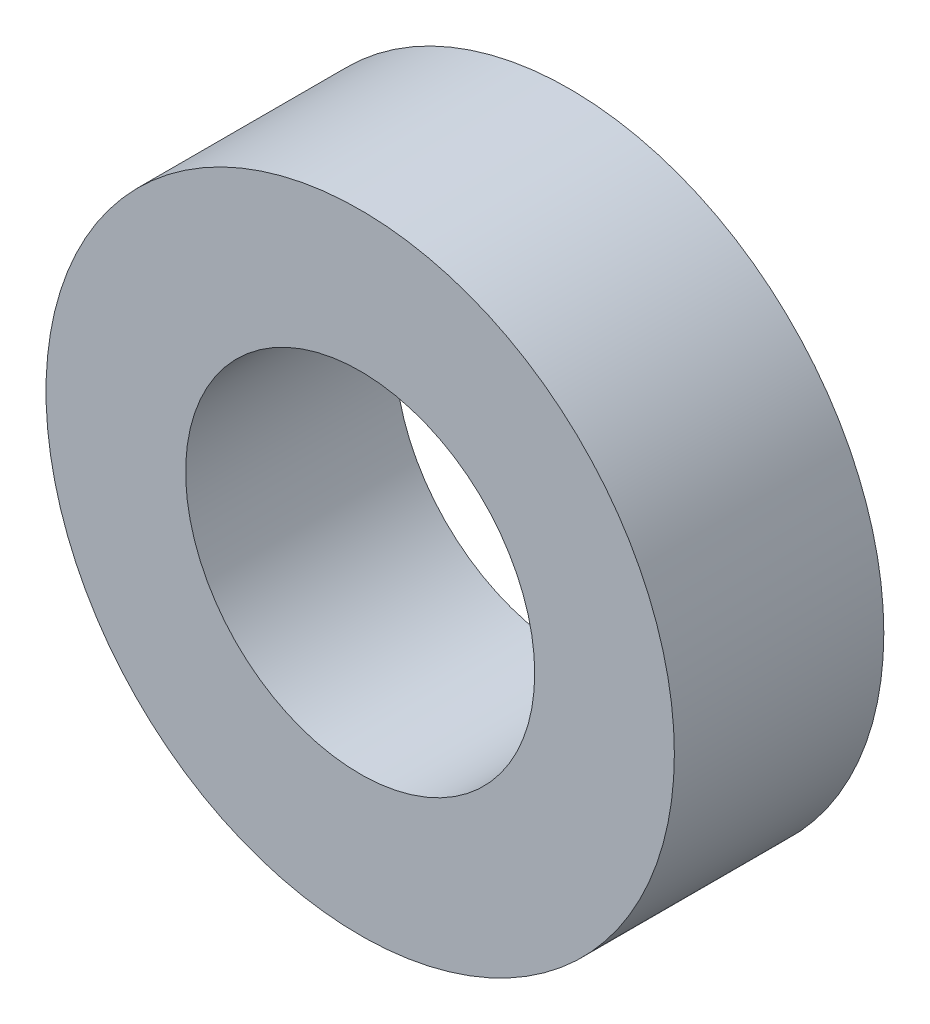
ISO-10303-21;
HEADER;
FILE_DESCRIPTION(('STEP AP214'),'2;1');
FILE_NAME('part.step','',(''),(''),'','','');
FILE_SCHEMA(('AUTOMOTIVE_DESIGN { 1 0 10303 214 1 1 1 1 }'));
ENDSEC;
DATA;
#1=APPLICATION_CONTEXT('core data for automotive mechanical design processes');
#2=APPLICATION_PROTOCOL_DEFINITION('international standard','automotive_design',2000,#1);
#3=PRODUCT_CONTEXT('',#1,'mechanical');
#4=PRODUCT('Part','Part','',(#3));
#5=PRODUCT_RELATED_PRODUCT_CATEGORY('part','',(#4));
#6=PRODUCT_DEFINITION_FORMATION('','',#4);
#7=PRODUCT_DEFINITION_CONTEXT('part definition',#1,'design');
#8=PRODUCT_DEFINITION('design','',#6,#7);
#9=PRODUCT_DEFINITION_SHAPE('','',#8);
#10=(LENGTH_UNIT() NAMED_UNIT(*) SI_UNIT(.MILLI.,.METRE.));
#11=(NAMED_UNIT(*) PLANE_ANGLE_UNIT() SI_UNIT($,.RADIAN.));
#12=(NAMED_UNIT(*) SI_UNIT($,.STERADIAN.) SOLID_ANGLE_UNIT());
#13=UNCERTAINTY_MEASURE_WITH_UNIT(LENGTH_MEASURE(1.E-05),#10,'distance_accuracy_value','');
#14=(GEOMETRIC_REPRESENTATION_CONTEXT(3) GLOBAL_UNCERTAINTY_ASSIGNED_CONTEXT((#13)) GLOBAL_UNIT_ASSIGNED_CONTEXT((#10,
#11,#12)) REPRESENTATION_CONTEXT('',''));
#15=CARTESIAN_POINT('',(0.,0.,0.));
#16=DIRECTION('',(0.,0.,1.));
#17=DIRECTION('',(1.,0.,0.));
#18=AXIS2_PLACEMENT_3D('',#15,#16,#17);
#19=CARTESIAN_POINT('',(0.,0.,6.));
#20=DIRECTION('',(0.,0.,1.));
#21=DIRECTION('',(1.,0.,0.));
#22=AXIS2_PLACEMENT_3D('',#19,#20,#21);
#23=PLANE('',#22);
#24=CARTESIAN_POINT('',(0.,0.,6.));
#25=DIRECTION('',(0.,0.,1.));
#26=DIRECTION('',(1.,0.,0.));
#27=AXIS2_PLACEMENT_3D('',#24,#25,#26);
#28=CIRCLE('',#27,9.);
#29=CARTESIAN_POINT('',(9.,0.,6.));
#30=VERTEX_POINT('',#29);
#31=EDGE_CURVE('E10',#30,#30,#28,.T.);
#32=ORIENTED_EDGE('',*,*,#31,.T.);
#33=EDGE_LOOP('',(#32));
#34=FACE_BOUND('',#33,.T.);
#35=CARTESIAN_POINT('',(0.,0.,6.));
#36=DIRECTION('',(0.,0.,1.));
#37=DIRECTION('',(1.,0.,0.));
#38=AXIS2_PLACEMENT_3D('',#35,#36,#37);
#39=CIRCLE('',#38,5.);
#40=CARTESIAN_POINT('',(5.,0.,6.));
#41=VERTEX_POINT('',#40);
#42=EDGE_CURVE('E48',#41,#41,#39,.T.);
#43=ORIENTED_EDGE('',*,*,#42,.F.);
#44=EDGE_LOOP('',(#43));
#45=FACE_BOUND('',#44,.T.);
#46=ADVANCED_FACE('F40',(#34,#45),#23,.T.);
#47=CARTESIAN_POINT('',(0.,0.,0.));
#48=DIRECTION('',(0.,0.,1.));
#49=DIRECTION('',(1.,0.,0.));
#50=AXIS2_PLACEMENT_3D('',#47,#48,#49);
#51=PLANE('',#50);
#52=CARTESIAN_POINT('',(0.,0.,0.));
#53=DIRECTION('',(0.,0.,1.));
#54=DIRECTION('',(1.,0.,0.));
#55=AXIS2_PLACEMENT_3D('',#52,#53,#54);
#56=CIRCLE('',#55,9.);
#57=CARTESIAN_POINT('',(9.,0.,0.));
#58=VERTEX_POINT('',#57);
#59=EDGE_CURVE('E41',#58,#58,#56,.T.);
#60=ORIENTED_EDGE('',*,*,#59,.F.);
#61=EDGE_LOOP('',(#60));
#62=FACE_BOUND('',#61,.T.);
#63=CARTESIAN_POINT('',(0.,0.,0.));
#64=DIRECTION('',(0.,0.,1.));
#65=DIRECTION('',(1.,0.,0.));
#66=AXIS2_PLACEMENT_3D('',#63,#64,#65);
#67=CIRCLE('',#66,5.);
#68=CARTESIAN_POINT('',(5.,0.,0.));
#69=VERTEX_POINT('',#68);
#70=EDGE_CURVE('E49',#69,#69,#67,.T.);
#71=ORIENTED_EDGE('',*,*,#70,.T.);
#72=EDGE_LOOP('',(#71));
#73=FACE_BOUND('',#72,.T.);
#74=ADVANCED_FACE('F58',(#62,#73),#51,.F.);
#75=CARTESIAN_POINT('',(0.,0.,6.));
#76=DIRECTION('',(0.,0.,-1.));
#77=DIRECTION('',(-1.,0.,0.));
#78=AXIS2_PLACEMENT_3D('',#75,#76,#77);
#79=CYLINDRICAL_SURFACE('',#78,9.);
#80=ORIENTED_EDGE('',*,*,#31,.F.);
#81=EDGE_LOOP('',(#80));
#82=FACE_BOUND('',#81,.T.);
#83=ORIENTED_EDGE('',*,*,#59,.T.);
#84=EDGE_LOOP('',(#83));
#85=FACE_BOUND('',#84,.T.);
#86=ADVANCED_FACE('F39',(#82,#85),#79,.T.);
#87=CARTESIAN_POINT('',(0.,0.,6.));
#88=DIRECTION('',(0.,0.,-1.));
#89=DIRECTION('',(-1.,0.,0.));
#90=AXIS2_PLACEMENT_3D('',#87,#88,#89);
#91=CYLINDRICAL_SURFACE('',#90,5.);
#92=ORIENTED_EDGE('',*,*,#42,.T.);
#93=EDGE_LOOP('',(#92));
#94=FACE_BOUND('',#93,.T.);
#95=ORIENTED_EDGE('',*,*,#70,.F.);
#96=EDGE_LOOP('',(#95));
#97=FACE_BOUND('',#96,.T.);
#98=ADVANCED_FACE('F57',(#94,#97),#91,.F.);
#99=CLOSED_SHELL('',(#46,#74,#86,#98));
#100=MANIFOLD_SOLID_BREP('B2',#99);
#101=ADVANCED_BREP_SHAPE_REPRESENTATION('',(#18,#100),#14);
#102=SHAPE_DEFINITION_REPRESENTATION(#9,#101);
ENDSEC;
END-ISO-10303-21;
